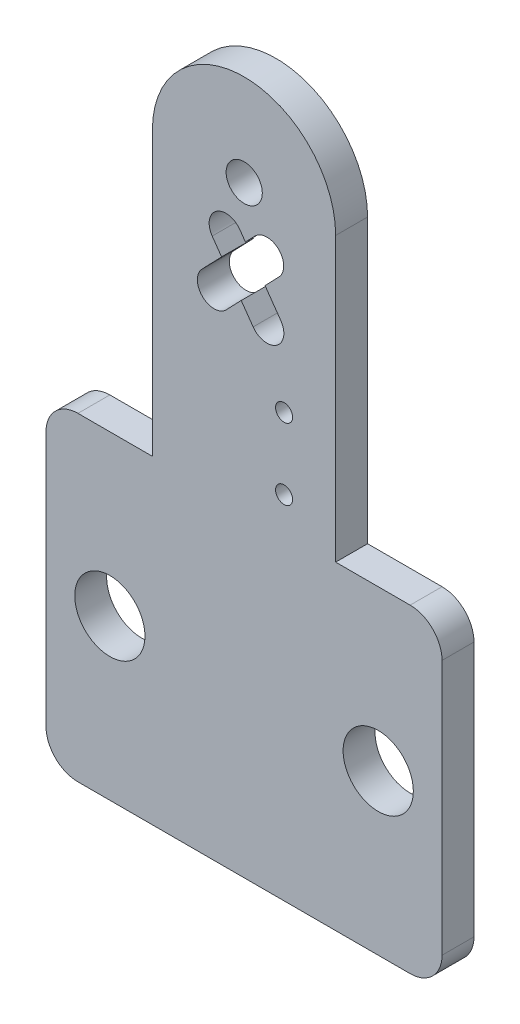
ISO-10303-21;
HEADER;
FILE_DESCRIPTION(('STEP AP214'),'2;1');
FILE_NAME('part.step','',(''),(''),'','','');
FILE_SCHEMA(('AUTOMOTIVE_DESIGN { 1 0 10303 214 1 1 1 1 }'));
ENDSEC;
DATA;
#1=APPLICATION_CONTEXT('core data for automotive mechanical design processes');
#2=APPLICATION_PROTOCOL_DEFINITION('international standard','automotive_design',2000,#1);
#3=PRODUCT_CONTEXT('',#1,'mechanical');
#4=PRODUCT('Part','Part','',(#3));
#5=PRODUCT_RELATED_PRODUCT_CATEGORY('part','',(#4));
#6=PRODUCT_DEFINITION_FORMATION('','',#4);
#7=PRODUCT_DEFINITION_CONTEXT('part definition',#1,'design');
#8=PRODUCT_DEFINITION('design','',#6,#7);
#9=PRODUCT_DEFINITION_SHAPE('','',#8);
#10=(LENGTH_UNIT() NAMED_UNIT(*) SI_UNIT(.MILLI.,.METRE.));
#11=(NAMED_UNIT(*) PLANE_ANGLE_UNIT() SI_UNIT($,.RADIAN.));
#12=(NAMED_UNIT(*) SI_UNIT($,.STERADIAN.) SOLID_ANGLE_UNIT());
#13=UNCERTAINTY_MEASURE_WITH_UNIT(LENGTH_MEASURE(1.E-05),#10,'distance_accuracy_value','');
#14=(GEOMETRIC_REPRESENTATION_CONTEXT(3) GLOBAL_UNCERTAINTY_ASSIGNED_CONTEXT((#13)) GLOBAL_UNIT_ASSIGNED_CONTEXT((#10,
#11,#12)) REPRESENTATION_CONTEXT('',''));
#15=CARTESIAN_POINT('',(0.,0.,0.));
#16=DIRECTION('',(0.,0.,1.));
#17=DIRECTION('',(1.,0.,0.));
#18=AXIS2_PLACEMENT_3D('',#15,#16,#17);
#19=CARTESIAN_POINT('',(78.0000000000004,-14.9999999999999,3.));
#20=DIRECTION('',(-1.,0.,0.));
#21=DIRECTION('',(0.,-1.,0.));
#22=AXIS2_PLACEMENT_3D('',#19,#20,#21);
#23=PLANE('',#22);
#24=DIRECTION('',(0.,1.,0.));
#25=VECTOR('',#24,1.);
#26=CARTESIAN_POINT('',(78.0000000000004,-14.9999999999999,3.));
#27=LINE('',#26,#25);
#28=CARTESIAN_POINT('',(78.0000000000004,-11.9999999999999,3.));
#29=VERTEX_POINT('',#28);
#30=CARTESIAN_POINT('',(78.0000000000004,11.9999999999999,3.));
#31=VERTEX_POINT('',#30);
#32=EDGE_CURVE('E311',#29,#31,#27,.T.);
#33=ORIENTED_EDGE('',*,*,#32,.F.);
#34=DIRECTION('',(0.,0.,-1.));
#35=VECTOR('',#34,1.);
#36=CARTESIAN_POINT('',(78.0000000000004,-11.9999999999999,3.));
#37=LINE('',#36,#35);
#38=CARTESIAN_POINT('',(78.0000000000004,-11.9999999999999,0.));
#39=VERTEX_POINT('',#38);
#40=EDGE_CURVE('E364',#29,#39,#37,.T.);
#41=ORIENTED_EDGE('',*,*,#40,.T.);
#42=DIRECTION('',(0.,1.,0.));
#43=VECTOR('',#42,1.);
#44=CARTESIAN_POINT('',(78.0000000000004,-14.9999999999999,0.));
#45=LINE('',#44,#43);
#46=CARTESIAN_POINT('',(78.0000000000004,11.9999999999999,0.));
#47=VERTEX_POINT('',#46);
#48=EDGE_CURVE('E310',#39,#47,#45,.T.);
#49=ORIENTED_EDGE('',*,*,#48,.T.);
#50=DIRECTION('',(0.,0.,-1.));
#51=VECTOR('',#50,1.);
#52=CARTESIAN_POINT('',(78.0000000000004,11.9999999999999,3.));
#53=LINE('',#52,#51);
#54=EDGE_CURVE('E362',#47,#31,#53,.F.);
#55=ORIENTED_EDGE('',*,*,#54,.T.);
#56=EDGE_LOOP('',(#33,#41,#49,#55));
#57=FACE_BOUND('',#56,.T.);
#58=ADVANCED_FACE('F37',(#57),#23,.F.);
#59=CARTESIAN_POINT('',(78.0000000000004,14.9999999999999,3.));
#60=DIRECTION('',(0.,-1.,0.));
#61=DIRECTION('',(1.,0.,0.));
#62=AXIS2_PLACEMENT_3D('',#59,#60,#61);
#63=PLANE('',#62);
#64=DIRECTION('',(-1.,0.,0.));
#65=VECTOR('',#64,1.);
#66=CARTESIAN_POINT('',(78.0000000000004,14.9999999999999,3.));
#67=LINE('',#66,#65);
#68=CARTESIAN_POINT('',(75.0000000000004,14.9999999999999,3.));
#69=VERTEX_POINT('',#68);
#70=CARTESIAN_POINT('',(68.0000000000001,15.,3.));
#71=VERTEX_POINT('',#70);
#72=EDGE_CURVE('E314',#69,#71,#67,.T.);
#73=ORIENTED_EDGE('',*,*,#72,.F.);
#74=DIRECTION('',(0.,0.,-1.));
#75=VECTOR('',#74,1.);
#76=CARTESIAN_POINT('',(75.0000000000004,14.9999999999999,3.));
#77=LINE('',#76,#75);
#78=CARTESIAN_POINT('',(75.0000000000004,14.9999999999999,0.));
#79=VERTEX_POINT('',#78);
#80=EDGE_CURVE('E11',#69,#79,#77,.T.);
#81=ORIENTED_EDGE('',*,*,#80,.T.);
#82=DIRECTION('',(-1.,0.,0.));
#83=VECTOR('',#82,1.);
#84=CARTESIAN_POINT('',(78.0000000000004,14.9999999999999,0.));
#85=LINE('',#84,#83);
#86=CARTESIAN_POINT('',(68.0000000000001,15.,0.));
#87=VERTEX_POINT('',#86);
#88=EDGE_CURVE('E335',#79,#87,#85,.T.);
#89=ORIENTED_EDGE('',*,*,#88,.T.);
#90=DIRECTION('',(0.,0.,-1.));
#91=VECTOR('',#90,1.);
#92=CARTESIAN_POINT('',(68.0000000000001,15.,3.));
#93=LINE('',#92,#91);
#94=EDGE_CURVE('E359',#71,#87,#93,.T.);
#95=ORIENTED_EDGE('',*,*,#94,.F.);
#96=EDGE_LOOP('',(#73,#81,#89,#95));
#97=FACE_BOUND('',#96,.T.);
#98=ADVANCED_FACE('F435',(#97),#63,.F.);
#99=CARTESIAN_POINT('',(68.0000000000001,15.,3.));
#100=DIRECTION('',(-1.,0.,0.));
#101=DIRECTION('',(0.,-1.,0.));
#102=AXIS2_PLACEMENT_3D('',#99,#100,#101);
#103=PLANE('',#102);
#104=DIRECTION('',(0.,1.,0.));
#105=VECTOR('',#104,1.);
#106=CARTESIAN_POINT('',(68.0000000000001,15.,0.));
#107=LINE('',#106,#105);
#108=CARTESIAN_POINT('',(68.0000000000001,41.5958,0.));
#109=VERTEX_POINT('',#108);
#110=EDGE_CURVE('E337',#87,#109,#107,.T.);
#111=ORIENTED_EDGE('',*,*,#110,.T.);
#112=DIRECTION('',(0.,0.,-1.));
#113=VECTOR('',#112,1.);
#114=CARTESIAN_POINT('',(68.0000000000001,41.5958,3.));
#115=LINE('',#114,#113);
#116=CARTESIAN_POINT('',(68.0000000000001,41.5958,3.));
#117=VERTEX_POINT('',#116);
#118=EDGE_CURVE('E356',#117,#109,#115,.T.);
#119=ORIENTED_EDGE('',*,*,#118,.F.);
#120=DIRECTION('',(0.,1.,0.));
#121=VECTOR('',#120,1.);
#122=CARTESIAN_POINT('',(68.0000000000001,15.,3.));
#123=LINE('',#122,#121);
#124=EDGE_CURVE('E317',#71,#117,#123,.T.);
#125=ORIENTED_EDGE('',*,*,#124,.F.);
#126=ORIENTED_EDGE('',*,*,#94,.T.);
#127=EDGE_LOOP('',(#111,#119,#125,#126));
#128=FACE_BOUND('',#127,.T.);
#129=ADVANCED_FACE('F442',(#128),#103,.F.);
#130=CARTESIAN_POINT('',(59.386891496535,41.5958,3.));
#131=DIRECTION('',(0.,0.,-1.));
#132=DIRECTION('',(-1.,0.,0.));
#133=AXIS2_PLACEMENT_3D('',#130,#131,#132);
#134=CYLINDRICAL_SURFACE('',#133,8.61310850346502);
#135=CARTESIAN_POINT('',(59.386891496535,41.5958,0.));
#136=DIRECTION('',(0.,0.,1.));
#137=DIRECTION('',(1.,0.,0.));
#138=AXIS2_PLACEMENT_3D('',#135,#136,#137);
#139=CIRCLE('',#138,8.61310850346502);
#140=CARTESIAN_POINT('',(50.77378299307,41.5958,0.));
#141=VERTEX_POINT('',#140);
#142=EDGE_CURVE('E339',#109,#141,#139,.T.);
#143=ORIENTED_EDGE('',*,*,#142,.T.);
#144=DIRECTION('',(0.,0.,-1.));
#145=VECTOR('',#144,1.);
#146=CARTESIAN_POINT('',(50.77378299307,41.5958,3.));
#147=LINE('',#146,#145);
#148=CARTESIAN_POINT('',(50.77378299307,41.5958,3.));
#149=VERTEX_POINT('',#148);
#150=EDGE_CURVE('E353',#149,#141,#147,.T.);
#151=ORIENTED_EDGE('',*,*,#150,.F.);
#152=CARTESIAN_POINT('',(59.386891496535,41.5958,3.));
#153=DIRECTION('',(0.,0.,1.));
#154=DIRECTION('',(1.,0.,0.));
#155=AXIS2_PLACEMENT_3D('',#152,#153,#154);
#156=CIRCLE('',#155,8.61310850346502);
#157=EDGE_CURVE('E319',#117,#149,#156,.T.);
#158=ORIENTED_EDGE('',*,*,#157,.F.);
#159=ORIENTED_EDGE('',*,*,#118,.T.);
#160=EDGE_LOOP('',(#143,#151,#158,#159));
#161=FACE_BOUND('',#160,.T.);
#162=ADVANCED_FACE('F445',(#161),#134,.T.);
#163=CARTESIAN_POINT('',(50.7737829930701,14.9999999999999,3.));
#164=DIRECTION('',(1.,0.,0.));
#165=DIRECTION('',(0.,1.,0.));
#166=AXIS2_PLACEMENT_3D('',#163,#164,#165);
#167=PLANE('',#166);
#168=DIRECTION('',(0.,-1.,0.));
#169=VECTOR('',#168,1.);
#170=CARTESIAN_POINT('',(50.7737829930701,14.9999999999999,0.));
#171=LINE('',#170,#169);
#172=CARTESIAN_POINT('',(50.7737829930701,14.9999999999999,0.));
#173=VERTEX_POINT('',#172);
#174=EDGE_CURVE('E341',#141,#173,#171,.T.);
#175=ORIENTED_EDGE('',*,*,#174,.T.);
#176=DIRECTION('',(0.,0.,-1.));
#177=VECTOR('',#176,1.);
#178=CARTESIAN_POINT('',(50.7737829930701,14.9999999999999,3.));
#179=LINE('',#178,#177);
#180=CARTESIAN_POINT('',(50.7737829930701,14.9999999999999,3.));
#181=VERTEX_POINT('',#180);
#182=EDGE_CURVE('E332',#181,#173,#179,.T.);
#183=ORIENTED_EDGE('',*,*,#182,.F.);
#184=DIRECTION('',(0.,-1.,0.));
#185=VECTOR('',#184,1.);
#186=CARTESIAN_POINT('',(50.7737829930701,14.9999999999999,3.));
#187=LINE('',#186,#185);
#188=EDGE_CURVE('E321',#149,#181,#187,.T.);
#189=ORIENTED_EDGE('',*,*,#188,.F.);
#190=ORIENTED_EDGE('',*,*,#150,.T.);
#191=EDGE_LOOP('',(#175,#183,#189,#190));
#192=FACE_BOUND('',#191,.T.);
#193=ADVANCED_FACE('F448',(#192),#167,.F.);
#194=CARTESIAN_POINT('',(50.7737829930701,14.9999999999999,3.));
#195=DIRECTION('',(0.,-1.,0.));
#196=DIRECTION('',(1.,0.,0.));
#197=AXIS2_PLACEMENT_3D('',#194,#195,#196);
#198=PLANE('',#197);
#199=DIRECTION('',(-1.,0.,0.));
#200=VECTOR('',#199,1.);
#201=CARTESIAN_POINT('',(50.7737829930701,14.9999999999999,0.));
#202=LINE('',#201,#200);
#203=CARTESIAN_POINT('',(43.7737829930697,14.9999999999999,0.));
#204=VERTEX_POINT('',#203);
#205=EDGE_CURVE('E343',#173,#204,#202,.T.);
#206=ORIENTED_EDGE('',*,*,#205,.T.);
#207=DIRECTION('',(0.,0.,-1.));
#208=VECTOR('',#207,1.);
#209=CARTESIAN_POINT('',(43.7737829930697,14.9999999999999,3.));
#210=LINE('',#209,#208);
#211=CARTESIAN_POINT('',(43.7737829930697,14.9999999999999,3.));
#212=VERTEX_POINT('',#211);
#213=EDGE_CURVE('E45',#204,#212,#210,.F.);
#214=ORIENTED_EDGE('',*,*,#213,.T.);
#215=DIRECTION('',(-1.,0.,0.));
#216=VECTOR('',#215,1.);
#217=CARTESIAN_POINT('',(50.7737829930701,14.9999999999999,3.));
#218=LINE('',#217,#216);
#219=EDGE_CURVE('E323',#181,#212,#218,.T.);
#220=ORIENTED_EDGE('',*,*,#219,.F.);
#221=ORIENTED_EDGE('',*,*,#182,.T.);
#222=EDGE_LOOP('',(#206,#214,#220,#221));
#223=FACE_BOUND('',#222,.T.);
#224=ADVANCED_FACE('F395',(#223),#198,.F.);
#225=CARTESIAN_POINT('',(40.7737829930697,-14.9999999999999,3.));
#226=DIRECTION('',(1.,0.,0.));
#227=DIRECTION('',(0.,0.,-1.));
#228=AXIS2_PLACEMENT_3D('',#225,#226,#227);
#229=PLANE('',#228);
#230=DIRECTION('',(0.,-1.,0.));
#231=VECTOR('',#230,1.);
#232=CARTESIAN_POINT('',(40.7737829930697,-14.9999999999999,0.));
#233=LINE('',#232,#231);
#234=CARTESIAN_POINT('',(40.7737829930697,11.9999999999999,0.));
#235=VERTEX_POINT('',#234);
#236=CARTESIAN_POINT('',(40.7737829930697,-11.9999999999999,0.));
#237=VERTEX_POINT('',#236);
#238=EDGE_CURVE('E346',#235,#237,#233,.T.);
#239=ORIENTED_EDGE('',*,*,#238,.T.);
#240=DIRECTION('',(0.,0.,-1.));
#241=VECTOR('',#240,1.);
#242=CARTESIAN_POINT('',(40.7737829930697,-11.9999999999999,3.));
#243=LINE('',#242,#241);
#244=CARTESIAN_POINT('',(40.7737829930697,-11.9999999999999,3.));
#245=VERTEX_POINT('',#244);
#246=EDGE_CURVE('E391',#237,#245,#243,.F.);
#247=ORIENTED_EDGE('',*,*,#246,.T.);
#248=DIRECTION('',(0.,-1.,0.));
#249=VECTOR('',#248,1.);
#250=CARTESIAN_POINT('',(40.7737829930697,-14.9999999999999,3.));
#251=LINE('',#250,#249);
#252=CARTESIAN_POINT('',(40.7737829930697,11.9999999999999,3.));
#253=VERTEX_POINT('',#252);
#254=EDGE_CURVE('E326',#253,#245,#251,.T.);
#255=ORIENTED_EDGE('',*,*,#254,.F.);
#256=DIRECTION('',(0.,0.,-1.));
#257=VECTOR('',#256,1.);
#258=CARTESIAN_POINT('',(40.7737829930697,11.9999999999999,3.));
#259=LINE('',#258,#257);
#260=EDGE_CURVE('E388',#253,#235,#259,.T.);
#261=ORIENTED_EDGE('',*,*,#260,.T.);
#262=EDGE_LOOP('',(#239,#247,#255,#261));
#263=FACE_BOUND('',#262,.T.);
#264=ADVANCED_FACE('F408',(#263),#229,.F.);
#265=CARTESIAN_POINT('',(78.0000000000004,-14.9999999999999,3.));
#266=DIRECTION('',(0.,1.,0.));
#267=DIRECTION('',(-1.,0.,0.));
#268=AXIS2_PLACEMENT_3D('',#265,#266,#267);
#269=PLANE('',#268);
#270=DIRECTION('',(1.,0.,0.));
#271=VECTOR('',#270,1.);
#272=CARTESIAN_POINT('',(78.0000000000004,-14.9999999999999,0.));
#273=LINE('',#272,#271);
#274=CARTESIAN_POINT('',(43.7737829930697,-14.9999999999999,0.));
#275=VERTEX_POINT('',#274);
#276=CARTESIAN_POINT('',(75.0000000000004,-14.9999999999999,0.));
#277=VERTEX_POINT('',#276);
#278=EDGE_CURVE('E315',#275,#277,#273,.T.);
#279=ORIENTED_EDGE('',*,*,#278,.T.);
#280=DIRECTION('',(0.,0.,-1.));
#281=VECTOR('',#280,1.);
#282=CARTESIAN_POINT('',(75.0000000000004,-14.9999999999999,3.));
#283=LINE('',#282,#281);
#284=CARTESIAN_POINT('',(75.0000000000004,-14.9999999999999,3.));
#285=VERTEX_POINT('',#284);
#286=EDGE_CURVE('E378',#277,#285,#283,.F.);
#287=ORIENTED_EDGE('',*,*,#286,.T.);
#288=DIRECTION('',(1.,0.,0.));
#289=VECTOR('',#288,1.);
#290=CARTESIAN_POINT('',(78.0000000000004,-14.9999999999999,3.));
#291=LINE('',#290,#289);
#292=CARTESIAN_POINT('',(43.7737829930697,-14.9999999999999,3.));
#293=VERTEX_POINT('',#292);
#294=EDGE_CURVE('E329',#293,#285,#291,.T.);
#295=ORIENTED_EDGE('',*,*,#294,.F.);
#296=DIRECTION('',(0.,0.,-1.));
#297=VECTOR('',#296,1.);
#298=CARTESIAN_POINT('',(43.7737829930697,-14.9999999999999,3.));
#299=LINE('',#298,#297);
#300=EDGE_CURVE('E375',#293,#275,#299,.T.);
#301=ORIENTED_EDGE('',*,*,#300,.T.);
#302=EDGE_LOOP('',(#279,#287,#295,#301));
#303=FACE_BOUND('',#302,.T.);
#304=ADVANCED_FACE('F419',(#303),#269,.F.);
#305=CARTESIAN_POINT('',(59.386891496535,41.5958,3.));
#306=DIRECTION('',(0.,0.,1.));
#307=DIRECTION('',(1.,0.,0.));
#308=AXIS2_PLACEMENT_3D('',#305,#306,#307);
#309=PLANE('',#308);
#310=CARTESIAN_POINT('',(63.15,24.765,3.));
#311=DIRECTION('',(0.,0.,1.));
#312=DIRECTION('',(1.,0.,0.));
#313=AXIS2_PLACEMENT_3D('',#310,#311,#312);
#314=CIRCLE('',#313,0.799999999999995);
#315=CARTESIAN_POINT('',(63.95,24.765,3.));
#316=VERTEX_POINT('',#315);
#317=EDGE_CURVE('E677',#316,#316,#314,.T.);
#318=ORIENTED_EDGE('',*,*,#317,.F.);
#319=EDGE_LOOP('',(#318));
#320=FACE_BOUND('',#319,.T.);
#321=CARTESIAN_POINT('',(63.15,18.065,3.));
#322=DIRECTION('',(0.,0.,1.));
#323=DIRECTION('',(1.,0.,0.));
#324=AXIS2_PLACEMENT_3D('',#321,#322,#323);
#325=CIRCLE('',#324,0.799999999999995);
#326=CARTESIAN_POINT('',(63.95,18.065,3.));
#327=VERTEX_POINT('',#326);
#328=EDGE_CURVE('E679',#327,#327,#325,.T.);
#329=ORIENTED_EDGE('',*,*,#328,.F.);
#330=EDGE_LOOP('',(#329));
#331=FACE_BOUND('',#330,.T.);
#332=DIRECTION('',(0.692977725126807,0.720958995004623,0.));
#333=VECTOR('',#332,1.);
#334=CARTESIAN_POINT('',(64.1111635278986,37.0548825444191,3.));
#335=LINE('',#334,#333);
#336=CARTESIAN_POINT('',(57.7116866895633,30.3970056421315,3.));
#337=VERTEX_POINT('',#336);
#338=CARTESIAN_POINT('',(59.1210275459214,31.8632533014383,3.));
#339=VERTEX_POINT('',#338);
#340=EDGE_CURVE('E290',#337,#339,#335,.T.);
#341=ORIENTED_EDGE('',*,*,#340,.F.);
#342=CARTESIAN_POINT('',(56.5761373593573,31.4884829620176,3.));
#343=DIRECTION('',(0.,0.,1.));
#344=DIRECTION('',(1.,0.,0.));
#345=AXIS2_PLACEMENT_3D('',#342,#343,#344);
#346=CIRCLE('',#345,1.57505397404564);
#347=CARTESIAN_POINT('',(55.4405880291513,32.5799602819037,3.));
#348=VERTEX_POINT('',#347);
#349=EDGE_CURVE('E249',#348,#337,#346,.T.);
#350=ORIENTED_EDGE('',*,*,#349,.F.);
#351=DIRECTION('',(-0.692977725126802,-0.720958995004628,0.));
#352=VECTOR('',#351,1.);
#353=CARTESIAN_POINT('',(61.8400648674866,39.2378371841914,3.));
#354=LINE('',#353,#352);
#355=CARTESIAN_POINT('',(57.275110448632,34.4885576175832,3.));
#356=VERTEX_POINT('',#355);
#357=EDGE_CURVE('E204',#356,#348,#354,.T.);
#358=ORIENTED_EDGE('',*,*,#357,.F.);
#359=DIRECTION('',(-0.575176751990258,0.818029158386141,0.));
#360=VECTOR('',#359,1.);
#361=CARTESIAN_POINT('',(54.6297091352262,38.2509061522047,3.));
#362=LINE('',#361,#360);
#363=CARTESIAN_POINT('',(56.3948296812813,35.7405124867041,3.));
#364=VERTEX_POINT('',#363);
#365=EDGE_CURVE('E270',#356,#364,#362,.T.);
#366=ORIENTED_EDGE('',*,*,#365,.T.);
#367=CARTESIAN_POINT('',(57.6934509702193,36.6536055804887,3.));
#368=DIRECTION('',(0.,0.,1.));
#369=DIRECTION('',(1.,0.,0.));
#370=AXIS2_PLACEMENT_3D('',#367,#368,#369);
#371=CIRCLE('',#370,1.5875);
#372=CARTESIAN_POINT('',(58.9920722591573,37.5666986742732,3.));
#373=VERTEX_POINT('',#372);
#374=EDGE_CURVE('E273',#373,#364,#371,.T.);
#375=ORIENTED_EDGE('',*,*,#374,.F.);
#376=DIRECTION('',(-0.575176751990258,0.818029158386141,0.));
#377=VECTOR('',#376,1.);
#378=CARTESIAN_POINT('',(57.2269517131022,40.0770923397738,3.));
#379=LINE('',#378,#377);
#380=CARTESIAN_POINT('',(59.5166604786021,36.8206176510628,3.));
#381=VERTEX_POINT('',#380);
#382=EDGE_CURVE('E275',#381,#373,#379,.T.);
#383=ORIENTED_EDGE('',*,*,#382,.F.);
#384=DIRECTION('',(-0.692977725126801,-0.720958995004628,0.));
#385=VECTOR('',#384,1.);
#386=CARTESIAN_POINT('',(61.8400648674866,39.2378371841914,3.));
#387=LINE('',#386,#385);
#388=CARTESIAN_POINT('',(60.405246140014,37.7450829003747,3.));
#389=VERTEX_POINT('',#388);
#390=EDGE_CURVE('E277',#389,#381,#387,.T.);
#391=ORIENTED_EDGE('',*,*,#390,.F.);
#392=CARTESIAN_POINT('',(61.54079547022,36.6536055804887,3.));
#393=DIRECTION('',(0.,0.,1.));
#394=DIRECTION('',(1.,0.,0.));
#395=AXIS2_PLACEMENT_3D('',#392,#393,#394);
#396=CIRCLE('',#395,1.57505397404566);
#397=CARTESIAN_POINT('',(62.6763448004259,35.5621282606026,3.));
#398=VERTEX_POINT('',#397);
#399=EDGE_CURVE('E279',#398,#389,#396,.T.);
#400=ORIENTED_EDGE('',*,*,#399,.F.);
#401=DIRECTION('',(0.692977725126807,0.720958995004623,0.));
#402=VECTOR('',#401,1.);
#403=CARTESIAN_POINT('',(64.1111635278986,37.0548825444191,3.));
#404=LINE('',#403,#402);
#405=CARTESIAN_POINT('',(61.3625775758915,34.1953133349179,3.));
#406=VERTEX_POINT('',#405);
#407=EDGE_CURVE('E281',#406,#398,#404,.T.);
#408=ORIENTED_EDGE('',*,*,#407,.F.);
#409=DIRECTION('',(-0.575176751990256,0.818029158386142,0.));
#410=VECTOR('',#409,1.);
#411=CARTESIAN_POINT('',(57.2269517131022,40.0770923397738,3.));
#412=LINE('',#411,#410);
#413=CARTESIAN_POINT('',(62.8394167591579,32.0949198298279,3.));
#414=VERTEX_POINT('',#413);
#415=EDGE_CURVE('E283',#414,#406,#412,.T.);
#416=ORIENTED_EDGE('',*,*,#415,.F.);
#417=CARTESIAN_POINT('',(61.54079547022,31.1818267360433,3.));
#418=DIRECTION('',(0.,0.,1.));
#419=DIRECTION('',(1.,0.,0.));
#420=AXIS2_PLACEMENT_3D('',#417,#418,#419);
#421=CIRCLE('',#420,1.58749999999999);
#422=CARTESIAN_POINT('',(60.242174181282,30.2687336422588,3.));
#423=VERTEX_POINT('',#422);
#424=EDGE_CURVE('E285',#423,#414,#421,.T.);
#425=ORIENTED_EDGE('',*,*,#424,.F.);
#426=DIRECTION('',(-0.575176751990257,0.818029158386141,0.));
#427=VECTOR('',#426,1.);
#428=CARTESIAN_POINT('',(54.6297091352262,38.2509061522047,3.));
#429=LINE('',#428,#427);
#430=EDGE_CURVE('E287',#423,#339,#429,.T.);
#431=ORIENTED_EDGE('',*,*,#430,.T.);
#432=EDGE_LOOP('',(#341,#350,#358,#366,#375,#383,#391,#400,#408,#416,#425,#431));
#433=FACE_BOUND('',#432,.T.);
#434=CARTESIAN_POINT('',(46.7737829930697,0.,3.));
#435=DIRECTION('',(0.,0.,1.));
#436=DIRECTION('',(1.,0.,0.));
#437=AXIS2_PLACEMENT_3D('',#434,#435,#436);
#438=CIRCLE('',#437,3.3);
#439=CARTESIAN_POINT('',(50.0737829930697,0.,3.));
#440=VERTEX_POINT('',#439);
#441=EDGE_CURVE('E292',#440,#440,#438,.T.);
#442=ORIENTED_EDGE('',*,*,#441,.F.);
#443=EDGE_LOOP('',(#442));
#444=FACE_BOUND('',#443,.T.);
#445=CARTESIAN_POINT('',(72.0000000000004,0.,3.));
#446=DIRECTION('',(0.,0.,1.));
#447=DIRECTION('',(1.,0.,0.));
#448=AXIS2_PLACEMENT_3D('',#445,#446,#447);
#449=CIRCLE('',#448,3.3);
#450=CARTESIAN_POINT('',(75.3000000000004,0.,3.));
#451=VERTEX_POINT('',#450);
#452=EDGE_CURVE('E298',#451,#451,#449,.T.);
#453=ORIENTED_EDGE('',*,*,#452,.F.);
#454=EDGE_LOOP('',(#453));
#455=FACE_BOUND('',#454,.T.);
#456=CARTESIAN_POINT('',(59.4035093402812,41.5958,3.));
#457=DIRECTION('',(0.,0.,1.));
#458=DIRECTION('',(1.,0.,0.));
#459=AXIS2_PLACEMENT_3D('',#456,#457,#458);
#460=CIRCLE('',#459,1.7);
#461=CARTESIAN_POINT('',(61.1035093402812,41.5958,3.));
#462=VERTEX_POINT('',#461);
#463=EDGE_CURVE('E304',#462,#462,#460,.T.);
#464=ORIENTED_EDGE('',*,*,#463,.F.);
#465=EDGE_LOOP('',(#464));
#466=FACE_BOUND('',#465,.T.);
#467=ORIENTED_EDGE('',*,*,#294,.T.);
#468=CARTESIAN_POINT('',(75.0000000000004,-11.9999999999999,3.));
#469=DIRECTION('',(0.,0.,1.));
#470=DIRECTION('',(1.,0.,0.));
#471=AXIS2_PLACEMENT_3D('',#468,#469,#470);
#472=CIRCLE('',#471,3.);
#473=EDGE_CURVE('E386',#285,#29,#472,.T.);
#474=ORIENTED_EDGE('',*,*,#473,.T.);
#475=ORIENTED_EDGE('',*,*,#32,.T.);
#476=CARTESIAN_POINT('',(75.0000000000004,11.9999999999999,3.));
#477=DIRECTION('',(0.,0.,1.));
#478=DIRECTION('',(1.,0.,0.));
#479=AXIS2_PLACEMENT_3D('',#476,#477,#478);
#480=CIRCLE('',#479,3.);
#481=EDGE_CURVE('E380',#31,#69,#480,.T.);
#482=ORIENTED_EDGE('',*,*,#481,.T.);
#483=ORIENTED_EDGE('',*,*,#72,.T.);
#484=ORIENTED_EDGE('',*,*,#124,.T.);
#485=ORIENTED_EDGE('',*,*,#157,.T.);
#486=ORIENTED_EDGE('',*,*,#188,.T.);
#487=ORIENTED_EDGE('',*,*,#219,.T.);
#488=CARTESIAN_POINT('',(43.7737829930697,11.9999999999999,3.));
#489=DIRECTION('',(0.,0.,1.));
#490=DIRECTION('',(1.,0.,0.));
#491=AXIS2_PLACEMENT_3D('',#488,#489,#490);
#492=CIRCLE('',#491,3.);
#493=EDGE_CURVE('E382',#212,#253,#492,.T.);
#494=ORIENTED_EDGE('',*,*,#493,.T.);
#495=ORIENTED_EDGE('',*,*,#254,.T.);
#496=CARTESIAN_POINT('',(43.7737829930697,-11.9999999999999,3.));
#497=DIRECTION('',(0.,0.,1.));
#498=DIRECTION('',(1.,0.,0.));
#499=AXIS2_PLACEMENT_3D('',#496,#497,#498);
#500=CIRCLE('',#499,3.);
#501=EDGE_CURVE('E384',#245,#293,#500,.T.);
#502=ORIENTED_EDGE('',*,*,#501,.T.);
#503=EDGE_LOOP('',(#467,#474,#475,#482,#483,#484,#485,#486,#487,#494,#495,#502));
#504=FACE_BOUND('',#503,.T.);
#505=ADVANCED_FACE('F400',(#320,#331,#433,#444,#455,#466,#504),#309,.T.);
#506=CARTESIAN_POINT('',(59.386891496535,41.5958,0.));
#507=DIRECTION('',(0.,0.,1.));
#508=DIRECTION('',(1.,0.,0.));
#509=AXIS2_PLACEMENT_3D('',#506,#507,#508);
#510=PLANE('',#509);
#511=CARTESIAN_POINT('',(63.15,24.765,0.));
#512=DIRECTION('',(0.,0.,1.));
#513=DIRECTION('',(1.,0.,0.));
#514=AXIS2_PLACEMENT_3D('',#511,#512,#513);
#515=CIRCLE('',#514,0.799999999999995);
#516=CARTESIAN_POINT('',(63.95,24.765,0.));
#517=VERTEX_POINT('',#516);
#518=EDGE_CURVE('E674',#517,#517,#515,.T.);
#519=ORIENTED_EDGE('',*,*,#518,.T.);
#520=EDGE_LOOP('',(#519));
#521=FACE_BOUND('',#520,.T.);
#522=CARTESIAN_POINT('',(63.15,18.065,0.));
#523=DIRECTION('',(0.,0.,1.));
#524=DIRECTION('',(1.,0.,0.));
#525=AXIS2_PLACEMENT_3D('',#522,#523,#524);
#526=CIRCLE('',#525,0.799999999999995);
#527=CARTESIAN_POINT('',(63.95,18.065,0.));
#528=VERTEX_POINT('',#527);
#529=EDGE_CURVE('E684',#528,#528,#526,.T.);
#530=ORIENTED_EDGE('',*,*,#529,.T.);
#531=EDGE_LOOP('',(#530));
#532=FACE_BOUND('',#531,.T.);
#533=CARTESIAN_POINT('',(56.5761373593573,31.4884829620176,0.));
#534=DIRECTION('',(0.,0.,-1.));
#535=DIRECTION('',(-1.,0.,0.));
#536=AXIS2_PLACEMENT_3D('',#533,#534,#535);
#537=CIRCLE('',#536,1.57505397404564);
#538=CARTESIAN_POINT('',(57.7116866895633,30.3970056421315,0.));
#539=VERTEX_POINT('',#538);
#540=CARTESIAN_POINT('',(55.4405880291513,32.5799602819036,0.));
#541=VERTEX_POINT('',#540);
#542=EDGE_CURVE('E210',#539,#541,#537,.T.);
#543=ORIENTED_EDGE('',*,*,#542,.F.);
#544=DIRECTION('',(-0.692977725126807,-0.720958995004623,0.));
#545=VECTOR('',#544,1.);
#546=CARTESIAN_POINT('',(14.8108854403375,-14.2360574882528,0.));
#547=LINE('',#546,#545);
#548=CARTESIAN_POINT('',(59.1210275459214,31.8632533014383,0.));
#549=VERTEX_POINT('',#548);
#550=EDGE_CURVE('E60',#549,#539,#547,.T.);
#551=ORIENTED_EDGE('',*,*,#550,.F.);
#552=DIRECTION('',(0.575176751990257,-0.818029158386141,0.));
#553=VECTOR('',#552,1.);
#554=CARTESIAN_POINT('',(54.5541412083378,38.3583805371127,0.));
#555=LINE('',#554,#553);
#556=CARTESIAN_POINT('',(60.242174181282,30.2687336422588,0.));
#557=VERTEX_POINT('',#556);
#558=EDGE_CURVE('E244',#549,#557,#555,.T.);
#559=ORIENTED_EDGE('',*,*,#558,.T.);
#560=CARTESIAN_POINT('',(61.54079547022,31.1818267360433,0.));
#561=DIRECTION('',(0.,0.,-1.));
#562=DIRECTION('',(-1.,0.,0.));
#563=AXIS2_PLACEMENT_3D('',#560,#561,#562);
#564=CIRCLE('',#563,1.58749999999999);
#565=CARTESIAN_POINT('',(62.8394167591579,32.0949198298279,0.));
#566=VERTEX_POINT('',#565);
#567=EDGE_CURVE('E241',#566,#557,#564,.T.);
#568=ORIENTED_EDGE('',*,*,#567,.F.);
#569=DIRECTION('',(0.575176751990256,-0.818029158386142,0.));
#570=VECTOR('',#569,1.);
#571=CARTESIAN_POINT('',(57.1513837862139,40.1845667246816,0.));
#572=LINE('',#571,#570);
#573=CARTESIAN_POINT('',(61.3625775758915,34.1953133349179,0.));
#574=VERTEX_POINT('',#573);
#575=EDGE_CURVE('E238',#574,#566,#572,.T.);
#576=ORIENTED_EDGE('',*,*,#575,.F.);
#577=DIRECTION('',(-0.692977725126807,-0.720958995004623,0.));
#578=VECTOR('',#577,1.);
#579=CARTESIAN_POINT('',(14.8108854403374,-14.2360574882528,0.));
#580=LINE('',#579,#578);
#581=CARTESIAN_POINT('',(62.6763448004259,35.5621282606026,0.));
#582=VERTEX_POINT('',#581);
#583=EDGE_CURVE('E235',#582,#574,#580,.T.);
#584=ORIENTED_EDGE('',*,*,#583,.F.);
#585=CARTESIAN_POINT('',(61.54079547022,36.6536055804887,0.));
#586=DIRECTION('',(0.,0.,-1.));
#587=DIRECTION('',(-1.,0.,0.));
#588=AXIS2_PLACEMENT_3D('',#585,#586,#587);
#589=CIRCLE('',#588,1.57505397404566);
#590=CARTESIAN_POINT('',(60.405246140014,37.7450829003747,0.));
#591=VERTEX_POINT('',#590);
#592=EDGE_CURVE('E232',#591,#582,#589,.T.);
#593=ORIENTED_EDGE('',*,*,#592,.F.);
#594=DIRECTION('',(0.692977725126801,0.720958995004628,0.));
#595=VECTOR('',#594,1.);
#596=CARTESIAN_POINT('',(12.539786779926,-12.0531028484809,0.));
#597=LINE('',#596,#595);
#598=CARTESIAN_POINT('',(59.5166604786021,36.8206176510628,0.));
#599=VERTEX_POINT('',#598);
#600=EDGE_CURVE('E229',#599,#591,#597,.T.);
#601=ORIENTED_EDGE('',*,*,#600,.F.);
#602=DIRECTION('',(0.575176751990258,-0.818029158386141,0.));
#603=VECTOR('',#602,1.);
#604=CARTESIAN_POINT('',(57.1513837862138,40.1845667246818,0.));
#605=LINE('',#604,#603);
#606=CARTESIAN_POINT('',(58.9920722591573,37.5666986742732,0.));
#607=VERTEX_POINT('',#606);
#608=EDGE_CURVE('E226',#607,#599,#605,.T.);
#609=ORIENTED_EDGE('',*,*,#608,.F.);
#610=CARTESIAN_POINT('',(57.6934509702193,36.6536055804887,0.));
#611=DIRECTION('',(0.,0.,-1.));
#612=DIRECTION('',(-1.,0.,0.));
#613=AXIS2_PLACEMENT_3D('',#610,#611,#612);
#614=CIRCLE('',#613,1.5875);
#615=CARTESIAN_POINT('',(56.3948296812813,35.7405124867041,0.));
#616=VERTEX_POINT('',#615);
#617=EDGE_CURVE('E220',#616,#607,#614,.T.);
#618=ORIENTED_EDGE('',*,*,#617,.F.);
#619=DIRECTION('',(0.575176751990258,-0.818029158386141,0.));
#620=VECTOR('',#619,1.);
#621=CARTESIAN_POINT('',(54.5541412083378,38.3583805371127,0.));
#622=LINE('',#621,#620);
#623=CARTESIAN_POINT('',(57.275110448632,34.4885576175832,0.));
#624=VERTEX_POINT('',#623);
#625=EDGE_CURVE('E218',#616,#624,#622,.T.);
#626=ORIENTED_EDGE('',*,*,#625,.T.);
#627=DIRECTION('',(0.692977725126802,0.720958995004628,0.));
#628=VECTOR('',#627,1.);
#629=CARTESIAN_POINT('',(12.5397867799259,-12.0531028484809,0.));
#630=LINE('',#629,#628);
#631=EDGE_CURVE('E201',#541,#624,#630,.T.);
#632=ORIENTED_EDGE('',*,*,#631,.F.);
#633=EDGE_LOOP('',(#543,#551,#559,#568,#576,#584,#593,#601,#609,#618,#626,#632));
#634=FACE_BOUND('',#633,.T.);
#635=CARTESIAN_POINT('',(46.7737829930697,0.,0.));
#636=DIRECTION('',(0.,0.,1.));
#637=DIRECTION('',(1.,0.,0.));
#638=AXIS2_PLACEMENT_3D('',#635,#636,#637);
#639=CIRCLE('',#638,3.3);
#640=CARTESIAN_POINT('',(50.0737829930697,0.,0.));
#641=VERTEX_POINT('',#640);
#642=EDGE_CURVE('E295',#641,#641,#639,.T.);
#643=ORIENTED_EDGE('',*,*,#642,.T.);
#644=EDGE_LOOP('',(#643));
#645=FACE_BOUND('',#644,.T.);
#646=CARTESIAN_POINT('',(72.0000000000004,0.,0.));
#647=DIRECTION('',(0.,0.,1.));
#648=DIRECTION('',(1.,0.,0.));
#649=AXIS2_PLACEMENT_3D('',#646,#647,#648);
#650=CIRCLE('',#649,3.3);
#651=CARTESIAN_POINT('',(75.3000000000004,0.,0.));
#652=VERTEX_POINT('',#651);
#653=EDGE_CURVE('E301',#652,#652,#650,.T.);
#654=ORIENTED_EDGE('',*,*,#653,.T.);
#655=EDGE_LOOP('',(#654));
#656=FACE_BOUND('',#655,.T.);
#657=CARTESIAN_POINT('',(59.4035093402812,41.5958,0.));
#658=DIRECTION('',(0.,0.,1.));
#659=DIRECTION('',(1.,0.,0.));
#660=AXIS2_PLACEMENT_3D('',#657,#658,#659);
#661=CIRCLE('',#660,1.7);
#662=CARTESIAN_POINT('',(61.1035093402812,41.5958,0.));
#663=VERTEX_POINT('',#662);
#664=EDGE_CURVE('E307',#663,#663,#661,.T.);
#665=ORIENTED_EDGE('',*,*,#664,.T.);
#666=EDGE_LOOP('',(#665));
#667=FACE_BOUND('',#666,.T.);
#668=ORIENTED_EDGE('',*,*,#48,.F.);
#669=CARTESIAN_POINT('',(75.0000000000004,-11.9999999999999,0.));
#670=DIRECTION('',(0.,0.,1.));
#671=DIRECTION('',(1.,0.,0.));
#672=AXIS2_PLACEMENT_3D('',#669,#670,#671);
#673=CIRCLE('',#672,3.);
#674=EDGE_CURVE('E373',#39,#277,#673,.F.);
#675=ORIENTED_EDGE('',*,*,#674,.T.);
#676=ORIENTED_EDGE('',*,*,#278,.F.);
#677=CARTESIAN_POINT('',(43.7737829930697,-11.9999999999999,0.));
#678=DIRECTION('',(0.,0.,1.));
#679=DIRECTION('',(1.,0.,0.));
#680=AXIS2_PLACEMENT_3D('',#677,#678,#679);
#681=CIRCLE('',#680,3.);
#682=EDGE_CURVE('E371',#275,#237,#681,.F.);
#683=ORIENTED_EDGE('',*,*,#682,.T.);
#684=ORIENTED_EDGE('',*,*,#238,.F.);
#685=CARTESIAN_POINT('',(43.7737829930697,11.9999999999999,0.));
#686=DIRECTION('',(0.,0.,1.));
#687=DIRECTION('',(1.,0.,0.));
#688=AXIS2_PLACEMENT_3D('',#685,#686,#687);
#689=CIRCLE('',#688,3.);
#690=EDGE_CURVE('E369',#235,#204,#689,.F.);
#691=ORIENTED_EDGE('',*,*,#690,.T.);
#692=ORIENTED_EDGE('',*,*,#205,.F.);
#693=ORIENTED_EDGE('',*,*,#174,.F.);
#694=ORIENTED_EDGE('',*,*,#142,.F.);
#695=ORIENTED_EDGE('',*,*,#110,.F.);
#696=ORIENTED_EDGE('',*,*,#88,.F.);
#697=CARTESIAN_POINT('',(75.0000000000004,11.9999999999999,0.));
#698=DIRECTION('',(0.,0.,1.));
#699=DIRECTION('',(1.,0.,0.));
#700=AXIS2_PLACEMENT_3D('',#697,#698,#699);
#701=CIRCLE('',#700,3.);
#702=EDGE_CURVE('E367',#79,#47,#701,.F.);
#703=ORIENTED_EDGE('',*,*,#702,.T.);
#704=EDGE_LOOP('',(#668,#675,#676,#683,#684,#691,#692,#693,#694,#695,#696,#703));
#705=FACE_BOUND('',#704,.T.);
#706=ADVANCED_FACE('F214',(#521,#532,#634,#645,#656,#667,#705),#510,.F.);
#707=CARTESIAN_POINT('',(59.4035093402812,41.5958,3.));
#708=DIRECTION('',(0.,0.,1.));
#709=DIRECTION('',(1.,0.,0.));
#710=AXIS2_PLACEMENT_3D('',#707,#708,#709);
#711=CYLINDRICAL_SURFACE('',#710,1.7);
#712=ORIENTED_EDGE('',*,*,#664,.F.);
#713=EDGE_LOOP('',(#712));
#714=FACE_BOUND('',#713,.T.);
#715=ORIENTED_EDGE('',*,*,#463,.T.);
#716=EDGE_LOOP('',(#715));
#717=FACE_BOUND('',#716,.T.);
#718=ADVANCED_FACE('F496',(#714,#717),#711,.F.);
#719=CARTESIAN_POINT('',(72.0000000000004,0.,3.));
#720=DIRECTION('',(0.,0.,1.));
#721=DIRECTION('',(1.,0.,0.));
#722=AXIS2_PLACEMENT_3D('',#719,#720,#721);
#723=CYLINDRICAL_SURFACE('',#722,3.3);
#724=ORIENTED_EDGE('',*,*,#653,.F.);
#725=EDGE_LOOP('',(#724));
#726=FACE_BOUND('',#725,.T.);
#727=ORIENTED_EDGE('',*,*,#452,.T.);
#728=EDGE_LOOP('',(#727));
#729=FACE_BOUND('',#728,.T.);
#730=ADVANCED_FACE('F492',(#726,#729),#723,.F.);
#731=CARTESIAN_POINT('',(46.7737829930697,0.,3.));
#732=DIRECTION('',(0.,0.,1.));
#733=DIRECTION('',(1.,0.,0.));
#734=AXIS2_PLACEMENT_3D('',#731,#732,#733);
#735=CYLINDRICAL_SURFACE('',#734,3.3);
#736=ORIENTED_EDGE('',*,*,#642,.F.);
#737=EDGE_LOOP('',(#736));
#738=FACE_BOUND('',#737,.T.);
#739=ORIENTED_EDGE('',*,*,#441,.T.);
#740=EDGE_LOOP('',(#739));
#741=FACE_BOUND('',#740,.T.);
#742=ADVANCED_FACE('F469',(#738,#741),#735,.F.);
#743=CARTESIAN_POINT('',(75.0000000000004,-11.9999999999999,3.));
#744=DIRECTION('',(0.,0.,-1.));
#745=DIRECTION('',(-1.,0.,0.));
#746=AXIS2_PLACEMENT_3D('',#743,#744,#745);
#747=CYLINDRICAL_SURFACE('',#746,3.);
#748=ORIENTED_EDGE('',*,*,#473,.F.);
#749=ORIENTED_EDGE('',*,*,#286,.F.);
#750=ORIENTED_EDGE('',*,*,#674,.F.);
#751=ORIENTED_EDGE('',*,*,#40,.F.);
#752=EDGE_LOOP('',(#748,#749,#750,#751));
#753=FACE_BOUND('',#752,.T.);
#754=ADVANCED_FACE('F425',(#753),#747,.T.);
#755=CARTESIAN_POINT('',(43.7737829930697,-11.9999999999999,3.));
#756=DIRECTION('',(0.,0.,-1.));
#757=DIRECTION('',(-1.,0.,0.));
#758=AXIS2_PLACEMENT_3D('',#755,#756,#757);
#759=CYLINDRICAL_SURFACE('',#758,3.);
#760=ORIENTED_EDGE('',*,*,#501,.F.);
#761=ORIENTED_EDGE('',*,*,#246,.F.);
#762=ORIENTED_EDGE('',*,*,#682,.F.);
#763=ORIENTED_EDGE('',*,*,#300,.F.);
#764=EDGE_LOOP('',(#760,#761,#762,#763));
#765=FACE_BOUND('',#764,.T.);
#766=ADVANCED_FACE('F416',(#765),#759,.T.);
#767=CARTESIAN_POINT('',(43.7737829930697,11.9999999999999,3.));
#768=DIRECTION('',(0.,0.,-1.));
#769=DIRECTION('',(-1.,0.,0.));
#770=AXIS2_PLACEMENT_3D('',#767,#768,#769);
#771=CYLINDRICAL_SURFACE('',#770,3.);
#772=ORIENTED_EDGE('',*,*,#493,.F.);
#773=ORIENTED_EDGE('',*,*,#213,.F.);
#774=ORIENTED_EDGE('',*,*,#690,.F.);
#775=ORIENTED_EDGE('',*,*,#260,.F.);
#776=EDGE_LOOP('',(#772,#773,#774,#775));
#777=FACE_BOUND('',#776,.T.);
#778=ADVANCED_FACE('F405',(#777),#771,.T.);
#779=CARTESIAN_POINT('',(75.0000000000004,11.9999999999999,3.));
#780=DIRECTION('',(0.,0.,-1.));
#781=DIRECTION('',(-1.,0.,0.));
#782=AXIS2_PLACEMENT_3D('',#779,#780,#781);
#783=CYLINDRICAL_SURFACE('',#782,3.);
#784=ORIENTED_EDGE('',*,*,#481,.F.);
#785=ORIENTED_EDGE('',*,*,#54,.F.);
#786=ORIENTED_EDGE('',*,*,#702,.F.);
#787=ORIENTED_EDGE('',*,*,#80,.F.);
#788=EDGE_LOOP('',(#784,#785,#786,#787));
#789=FACE_BOUND('',#788,.T.);
#790=ADVANCED_FACE('F39',(#789),#783,.T.);
#791=CARTESIAN_POINT('',(14.8108854403375,-14.2360574882528,10.));
#792=DIRECTION('',(0.720958995004623,-0.692977725126807,0.));
#793=DIRECTION('',(0.692977725126807,0.720958995004623,0.));
#794=AXIS2_PLACEMENT_3D('',#791,#792,#793);
#795=PLANE('',#794);
#796=ORIENTED_EDGE('',*,*,#340,.T.);
#797=DIRECTION('',(0.,0.,-1.));
#798=VECTOR('',#797,1.);
#799=CARTESIAN_POINT('',(59.1210275459214,31.8632533014383,10.));
#800=LINE('',#799,#798);
#801=EDGE_CURVE('E247',#339,#549,#800,.T.);
#802=ORIENTED_EDGE('',*,*,#801,.T.);
#803=ORIENTED_EDGE('',*,*,#550,.T.);
#804=DIRECTION('',(0.,0.,-1.));
#805=VECTOR('',#804,1.);
#806=CARTESIAN_POINT('',(57.7116866895633,30.3970056421315,10.));
#807=LINE('',#806,#805);
#808=EDGE_CURVE('E207',#337,#539,#807,.T.);
#809=ORIENTED_EDGE('',*,*,#808,.F.);
#810=EDGE_LOOP('',(#796,#802,#803,#809));
#811=FACE_BOUND('',#810,.T.);
#812=ADVANCED_FACE('F475',(#811),#795,.F.);
#813=CARTESIAN_POINT('',(54.5541412083378,38.3583805371127,10.));
#814=DIRECTION('',(0.818029158386141,0.575176751990257,0.));
#815=DIRECTION('',(-0.575176751990257,0.818029158386141,0.));
#816=AXIS2_PLACEMENT_3D('',#813,#814,#815);
#817=PLANE('',#816);
#818=DIRECTION('',(0.,0.,-1.));
#819=VECTOR('',#818,1.);
#820=CARTESIAN_POINT('',(60.242174181282,30.2687336422588,10.));
#821=LINE('',#820,#819);
#822=EDGE_CURVE('E250',#423,#557,#821,.T.);
#823=ORIENTED_EDGE('',*,*,#822,.T.);
#824=ORIENTED_EDGE('',*,*,#558,.F.);
#825=ORIENTED_EDGE('',*,*,#801,.F.);
#826=ORIENTED_EDGE('',*,*,#430,.F.);
#827=EDGE_LOOP('',(#823,#824,#825,#826));
#828=FACE_BOUND('',#827,.T.);
#829=ADVANCED_FACE('F479',(#828),#817,.T.);
#830=CARTESIAN_POINT('',(61.54079547022,31.1818267360433,10.));
#831=DIRECTION('',(0.,0.,-1.));
#832=DIRECTION('',(-1.,0.,0.));
#833=AXIS2_PLACEMENT_3D('',#830,#831,#832);
#834=CYLINDRICAL_SURFACE('',#833,1.58749999999999);
#835=ORIENTED_EDGE('',*,*,#424,.T.);
#836=DIRECTION('',(0.,0.,-1.));
#837=VECTOR('',#836,1.);
#838=CARTESIAN_POINT('',(62.8394167591579,32.0949198298279,10.));
#839=LINE('',#838,#837);
#840=EDGE_CURVE('E252',#414,#566,#839,.T.);
#841=ORIENTED_EDGE('',*,*,#840,.T.);
#842=ORIENTED_EDGE('',*,*,#567,.T.);
#843=ORIENTED_EDGE('',*,*,#822,.F.);
#844=EDGE_LOOP('',(#835,#841,#842,#843));
#845=FACE_BOUND('',#844,.T.);
#846=ADVANCED_FACE('F484',(#845),#834,.F.);
#847=CARTESIAN_POINT('',(57.1513837862139,40.1845667246816,10.));
#848=DIRECTION('',(0.818029158386142,0.575176751990256,0.));
#849=DIRECTION('',(-0.575176751990256,0.818029158386142,0.));
#850=AXIS2_PLACEMENT_3D('',#847,#848,#849);
#851=PLANE('',#850);
#852=ORIENTED_EDGE('',*,*,#415,.T.);
#853=DIRECTION('',(0.,0.,-1.));
#854=VECTOR('',#853,1.);
#855=CARTESIAN_POINT('',(61.3625775758915,34.1953133349179,10.));
#856=LINE('',#855,#854);
#857=EDGE_CURVE('E254',#406,#574,#856,.T.);
#858=ORIENTED_EDGE('',*,*,#857,.T.);
#859=ORIENTED_EDGE('',*,*,#575,.T.);
#860=ORIENTED_EDGE('',*,*,#840,.F.);
#861=EDGE_LOOP('',(#852,#858,#859,#860));
#862=FACE_BOUND('',#861,.T.);
#863=ADVANCED_FACE('F556',(#862),#851,.F.);
#864=CARTESIAN_POINT('',(14.8108854403374,-14.2360574882528,10.));
#865=DIRECTION('',(0.720958995004623,-0.692977725126807,0.));
#866=DIRECTION('',(0.692977725126807,0.720958995004623,0.));
#867=AXIS2_PLACEMENT_3D('',#864,#865,#866);
#868=PLANE('',#867);
#869=ORIENTED_EDGE('',*,*,#407,.T.);
#870=DIRECTION('',(0.,0.,-1.));
#871=VECTOR('',#870,1.);
#872=CARTESIAN_POINT('',(62.6763448004259,35.5621282606026,10.));
#873=LINE('',#872,#871);
#874=EDGE_CURVE('E256',#398,#582,#873,.T.);
#875=ORIENTED_EDGE('',*,*,#874,.T.);
#876=ORIENTED_EDGE('',*,*,#583,.T.);
#877=ORIENTED_EDGE('',*,*,#857,.F.);
#878=EDGE_LOOP('',(#869,#875,#876,#877));
#879=FACE_BOUND('',#878,.T.);
#880=ADVANCED_FACE('F566',(#879),#868,.F.);
#881=CARTESIAN_POINT('',(61.54079547022,36.6536055804887,10.));
#882=DIRECTION('',(0.,0.,-1.));
#883=DIRECTION('',(-1.,0.,0.));
#884=AXIS2_PLACEMENT_3D('',#881,#882,#883);
#885=CYLINDRICAL_SURFACE('',#884,1.57505397404566);
#886=ORIENTED_EDGE('',*,*,#399,.T.);
#887=DIRECTION('',(0.,0.,-1.));
#888=VECTOR('',#887,1.);
#889=CARTESIAN_POINT('',(60.405246140014,37.7450829003747,10.));
#890=LINE('',#889,#888);
#891=EDGE_CURVE('E258',#389,#591,#890,.T.);
#892=ORIENTED_EDGE('',*,*,#891,.T.);
#893=ORIENTED_EDGE('',*,*,#592,.T.);
#894=ORIENTED_EDGE('',*,*,#874,.F.);
#895=EDGE_LOOP('',(#886,#892,#893,#894));
#896=FACE_BOUND('',#895,.T.);
#897=ADVANCED_FACE('F576',(#896),#885,.F.);
#898=CARTESIAN_POINT('',(12.539786779926,-12.0531028484809,10.));
#899=DIRECTION('',(-0.720958995004628,0.692977725126801,0.));
#900=DIRECTION('',(-0.692977725126801,-0.720958995004628,0.));
#901=AXIS2_PLACEMENT_3D('',#898,#899,#900);
#902=PLANE('',#901);
#903=ORIENTED_EDGE('',*,*,#390,.T.);
#904=DIRECTION('',(0.,0.,-1.));
#905=VECTOR('',#904,1.);
#906=CARTESIAN_POINT('',(59.5166604786021,36.8206176510628,10.));
#907=LINE('',#906,#905);
#908=EDGE_CURVE('E260',#381,#599,#907,.T.);
#909=ORIENTED_EDGE('',*,*,#908,.T.);
#910=ORIENTED_EDGE('',*,*,#600,.T.);
#911=ORIENTED_EDGE('',*,*,#891,.F.);
#912=EDGE_LOOP('',(#903,#909,#910,#911));
#913=FACE_BOUND('',#912,.T.);
#914=ADVANCED_FACE('F586',(#913),#902,.F.);
#915=CARTESIAN_POINT('',(57.1513837862138,40.1845667246818,10.));
#916=DIRECTION('',(0.818029158386141,0.575176751990258,0.));
#917=DIRECTION('',(-0.575176751990258,0.818029158386141,0.));
#918=AXIS2_PLACEMENT_3D('',#915,#916,#917);
#919=PLANE('',#918);
#920=ORIENTED_EDGE('',*,*,#382,.T.);
#921=DIRECTION('',(0.,0.,-1.));
#922=VECTOR('',#921,1.);
#923=CARTESIAN_POINT('',(58.9920722591573,37.5666986742732,10.));
#924=LINE('',#923,#922);
#925=EDGE_CURVE('E262',#373,#607,#924,.T.);
#926=ORIENTED_EDGE('',*,*,#925,.T.);
#927=ORIENTED_EDGE('',*,*,#608,.T.);
#928=ORIENTED_EDGE('',*,*,#908,.F.);
#929=EDGE_LOOP('',(#920,#926,#927,#928));
#930=FACE_BOUND('',#929,.T.);
#931=ADVANCED_FACE('F596',(#930),#919,.F.);
#932=CARTESIAN_POINT('',(57.6934509702193,36.6536055804887,10.));
#933=DIRECTION('',(0.,0.,-1.));
#934=DIRECTION('',(-1.,0.,0.));
#935=AXIS2_PLACEMENT_3D('',#932,#933,#934);
#936=CYLINDRICAL_SURFACE('',#935,1.5875);
#937=ORIENTED_EDGE('',*,*,#374,.T.);
#938=DIRECTION('',(0.,0.,-1.));
#939=VECTOR('',#938,1.);
#940=CARTESIAN_POINT('',(56.3948296812813,35.7405124867041,10.));
#941=LINE('',#940,#939);
#942=EDGE_CURVE('E264',#364,#616,#941,.T.);
#943=ORIENTED_EDGE('',*,*,#942,.T.);
#944=ORIENTED_EDGE('',*,*,#617,.T.);
#945=ORIENTED_EDGE('',*,*,#925,.F.);
#946=EDGE_LOOP('',(#937,#943,#944,#945));
#947=FACE_BOUND('',#946,.T.);
#948=ADVANCED_FACE('F606',(#947),#936,.F.);
#949=CARTESIAN_POINT('',(54.5541412083378,38.3583805371127,10.));
#950=DIRECTION('',(0.818029158386141,0.575176751990258,0.));
#951=DIRECTION('',(-0.575176751990258,0.818029158386141,0.));
#952=AXIS2_PLACEMENT_3D('',#949,#950,#951);
#953=PLANE('',#952);
#954=DIRECTION('',(0.,0.,-1.));
#955=VECTOR('',#954,1.);
#956=CARTESIAN_POINT('',(57.275110448632,34.4885576175832,10.));
#957=LINE('',#956,#955);
#958=EDGE_CURVE('E206',#356,#624,#957,.T.);
#959=ORIENTED_EDGE('',*,*,#958,.T.);
#960=ORIENTED_EDGE('',*,*,#625,.F.);
#961=ORIENTED_EDGE('',*,*,#942,.F.);
#962=ORIENTED_EDGE('',*,*,#365,.F.);
#963=EDGE_LOOP('',(#959,#960,#961,#962));
#964=FACE_BOUND('',#963,.T.);
#965=ADVANCED_FACE('F616',(#964),#953,.T.);
#966=CARTESIAN_POINT('',(12.5397867799259,-12.0531028484809,10.));
#967=DIRECTION('',(-0.720958995004628,0.692977725126802,0.));
#968=DIRECTION('',(-0.692977725126802,-0.720958995004628,0.));
#969=AXIS2_PLACEMENT_3D('',#966,#967,#968);
#970=PLANE('',#969);
#971=ORIENTED_EDGE('',*,*,#357,.T.);
#972=DIRECTION('',(0.,0.,-1.));
#973=VECTOR('',#972,1.);
#974=CARTESIAN_POINT('',(55.4405880291513,32.5799602819036,10.));
#975=LINE('',#974,#973);
#976=EDGE_CURVE('E52',#348,#541,#975,.T.);
#977=ORIENTED_EDGE('',*,*,#976,.T.);
#978=ORIENTED_EDGE('',*,*,#631,.T.);
#979=ORIENTED_EDGE('',*,*,#958,.F.);
#980=EDGE_LOOP('',(#971,#977,#978,#979));
#981=FACE_BOUND('',#980,.T.);
#982=ADVANCED_FACE('F198',(#981),#970,.F.);
#983=CARTESIAN_POINT('',(56.5761373593573,31.4884829620176,10.));
#984=DIRECTION('',(0.,0.,-1.));
#985=DIRECTION('',(-1.,0.,0.));
#986=AXIS2_PLACEMENT_3D('',#983,#984,#985);
#987=CYLINDRICAL_SURFACE('',#986,1.57505397404564);
#988=ORIENTED_EDGE('',*,*,#349,.T.);
#989=ORIENTED_EDGE('',*,*,#808,.T.);
#990=ORIENTED_EDGE('',*,*,#542,.T.);
#991=ORIENTED_EDGE('',*,*,#976,.F.);
#992=EDGE_LOOP('',(#988,#989,#990,#991));
#993=FACE_BOUND('',#992,.T.);
#994=ADVANCED_FACE('F211',(#993),#987,.F.);
#995=CARTESIAN_POINT('',(63.15,18.065,3.));
#996=DIRECTION('',(0.,0.,1.));
#997=DIRECTION('',(1.,0.,0.));
#998=AXIS2_PLACEMENT_3D('',#995,#996,#997);
#999=CYLINDRICAL_SURFACE('',#998,0.799999999999995);
#1000=ORIENTED_EDGE('',*,*,#529,.F.);
#1001=EDGE_LOOP('',(#1000));
#1002=FACE_BOUND('',#1001,.T.);
#1003=ORIENTED_EDGE('',*,*,#328,.T.);
#1004=EDGE_LOOP('',(#1003));
#1005=FACE_BOUND('',#1004,.T.);
#1006=ADVANCED_FACE('F641',(#1002,#1005),#999,.F.);
#1007=CARTESIAN_POINT('',(63.15,24.765,3.));
#1008=DIRECTION('',(0.,0.,1.));
#1009=DIRECTION('',(1.,0.,0.));
#1010=AXIS2_PLACEMENT_3D('',#1007,#1008,#1009);
#1011=CYLINDRICAL_SURFACE('',#1010,0.799999999999995);
#1012=ORIENTED_EDGE('',*,*,#518,.F.);
#1013=EDGE_LOOP('',(#1012));
#1014=FACE_BOUND('',#1013,.T.);
#1015=ORIENTED_EDGE('',*,*,#317,.T.);
#1016=EDGE_LOOP('',(#1015));
#1017=FACE_BOUND('',#1016,.T.);
#1018=ADVANCED_FACE('F657',(#1014,#1017),#1011,.F.);
#1019=CLOSED_SHELL('',(#58,#98,#129,#162,#193,#224,#264,#304,#505,#706,#718,#730,#742,#754,#766,
#778,#790,#812,#829,#846,#863,#880,#897,#914,#931,#948,#965,#982,#994,#1006,#1018));
#1020=MANIFOLD_SOLID_BREP('B2',#1019);
#1021=ADVANCED_BREP_SHAPE_REPRESENTATION('',(#18,#1020),#14);
#1022=SHAPE_DEFINITION_REPRESENTATION(#9,#1021);
ENDSEC;
END-ISO-10303-21;
